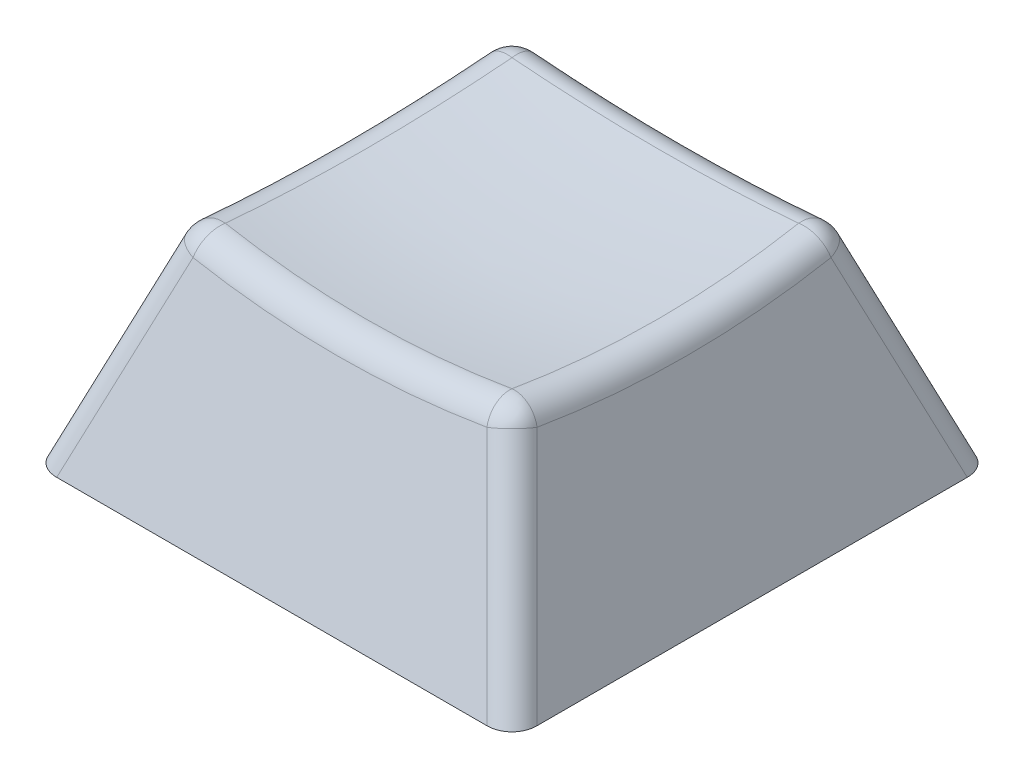
ISO-10303-21;
HEADER;
FILE_DESCRIPTION(('STEP AP214'),'2;1');
FILE_NAME('part.step','',(''),(''),'','','');
FILE_SCHEMA(('AUTOMOTIVE_DESIGN { 1 0 10303 214 1 1 1 1 }'));
ENDSEC;
DATA;
#1=APPLICATION_CONTEXT('core data for automotive mechanical design processes');
#2=APPLICATION_PROTOCOL_DEFINITION('international standard','automotive_design',2000,#1);
#3=PRODUCT_CONTEXT('',#1,'mechanical');
#4=PRODUCT('Part','Part','',(#3));
#5=PRODUCT_RELATED_PRODUCT_CATEGORY('part','',(#4));
#6=PRODUCT_DEFINITION_FORMATION('','',#4);
#7=PRODUCT_DEFINITION_CONTEXT('part definition',#1,'design');
#8=PRODUCT_DEFINITION('design','',#6,#7);
#9=PRODUCT_DEFINITION_SHAPE('','',#8);
#10=(LENGTH_UNIT() NAMED_UNIT(*) SI_UNIT(.MILLI.,.METRE.));
#11=(NAMED_UNIT(*) PLANE_ANGLE_UNIT() SI_UNIT($,.RADIAN.));
#12=(NAMED_UNIT(*) SI_UNIT($,.STERADIAN.) SOLID_ANGLE_UNIT());
#13=UNCERTAINTY_MEASURE_WITH_UNIT(LENGTH_MEASURE(1.E-05),#10,'distance_accuracy_value','');
#14=(GEOMETRIC_REPRESENTATION_CONTEXT(3) GLOBAL_UNCERTAINTY_ASSIGNED_CONTEXT((#13)) GLOBAL_UNIT_ASSIGNED_CONTEXT((#10,
#11,#12)) REPRESENTATION_CONTEXT('',''));
#15=CARTESIAN_POINT('',(0.,0.,0.));
#16=DIRECTION('',(0.,0.,1.));
#17=DIRECTION('',(1.,0.,0.));
#18=AXIS2_PLACEMENT_3D('',#15,#16,#17);
#19=CARTESIAN_POINT('',(9.,0.,9.));
#20=DIRECTION('',(0.,0.337095258423083,0.941470544812038));
#21=DIRECTION('',(0.,-0.941470544812038,0.337095258423083));
#22=AXIS2_PLACEMENT_3D('',#19,#20,#21);
#23=PLANE('',#22);
#24=DIRECTION('',(-1.,0.,0.));
#25=VECTOR('',#24,1.);
#26=CARTESIAN_POINT('',(9.,0.,9.));
#27=LINE('',#26,#25);
#28=CARTESIAN_POINT('',(8.05852945518796,0.,9.));
#29=VERTEX_POINT('',#28);
#30=CARTESIAN_POINT('',(-8.05852945518796,0.,9.));
#31=VERTEX_POINT('',#30);
#32=EDGE_CURVE('E265',#29,#31,#27,.T.);
#33=ORIENTED_EDGE('',*,*,#32,.F.);
#34=DIRECTION('',(0.31943430634042,-0.892145418564502,0.319434306340419));
#35=VECTOR('',#34,1.);
#36=CARTESIAN_POINT('',(8.15459548654862,-0.268302020343256,9.09606603136065));
#37=LINE('',#36,#35);
#38=CARTESIAN_POINT('',(5.50538439485167,7.13065761346935,6.4468549396637));
#39=VERTEX_POINT('',#38);
#40=EDGE_CURVE('E304',#29,#39,#37,.F.);
#41=ORIENTED_EDGE('',*,*,#40,.T.);
#42=CARTESIAN_POINT('',(0.,44.5576506117063,-6.95394867151931));
#43=DIRECTION('',(0.,0.337095258423083,0.941470544812038));
#44=DIRECTION('',(0.,-0.941470544812038,0.337095258423083));
#45=AXIS2_PLACEMENT_3D('',#42,#43,#44);
#46=CIRCLE('',#45,40.1331608479902);
#47=CARTESIAN_POINT('',(-5.50538439485167,7.13065761346935,6.44685493966371));
#48=VERTEX_POINT('',#47);
#49=EDGE_CURVE('E302',#39,#48,#46,.F.);
#50=ORIENTED_EDGE('',*,*,#49,.T.);
#51=DIRECTION('',(0.319434306340419,0.892145418564502,-0.31943430634042));
#52=VECTOR('',#51,1.);
#53=CARTESIAN_POINT('',(-8.15459548654862,-0.268302020343256,9.09606603136065));
#54=LINE('',#53,#52);
#55=EDGE_CURVE('E300',#48,#31,#54,.F.);
#56=ORIENTED_EDGE('',*,*,#55,.T.);
#57=EDGE_LOOP('',(#33,#41,#50,#56));
#58=FACE_BOUND('',#57,.T.);
#59=ADVANCED_FACE('F35',(#58),#23,.T.);
#60=CARTESIAN_POINT('',(9.,0.,-9.));
#61=DIRECTION('',(0.941470544812038,0.337095258423083,0.));
#62=DIRECTION('',(-0.337095258423083,0.941470544812038,0.));
#63=AXIS2_PLACEMENT_3D('',#60,#61,#62);
#64=PLANE('',#63);
#65=CARTESIAN_POINT('',(-6.95394867151931,44.5576506117063,0.));
#66=DIRECTION('',(0.941470544812038,0.337095258423083,0.));
#67=DIRECTION('',(-0.337095258423083,0.941470544812038,0.));
#68=AXIS2_PLACEMENT_3D('',#65,#66,#67);
#69=CIRCLE('',#68,40.1331608479902);
#70=CARTESIAN_POINT('',(6.4468549396637,7.13065761346936,-5.50538439485167));
#71=VERTEX_POINT('',#70);
#72=CARTESIAN_POINT('',(6.4468549396637,7.13065761346935,5.50538439485167));
#73=VERTEX_POINT('',#72);
#74=EDGE_CURVE('E296',#71,#73,#69,.F.);
#75=ORIENTED_EDGE('',*,*,#74,.T.);
#76=DIRECTION('',(0.31943430634042,-0.892145418564502,0.319434306340419));
#77=VECTOR('',#76,1.);
#78=CARTESIAN_POINT('',(7.25937706215132,4.86137133246757,6.31790651733929));
#79=LINE('',#78,#77);
#80=CARTESIAN_POINT('',(9.,0.,8.05852945518797));
#81=VERTEX_POINT('',#80);
#82=EDGE_CURVE('E298',#73,#81,#79,.T.);
#83=ORIENTED_EDGE('',*,*,#82,.T.);
#84=DIRECTION('',(0.,0.,1.));
#85=VECTOR('',#84,1.);
#86=CARTESIAN_POINT('',(9.,0.,-9.));
#87=LINE('',#86,#85);
#88=CARTESIAN_POINT('',(9.,0.,-8.05852945518796));
#89=VERTEX_POINT('',#88);
#90=EDGE_CURVE('E275',#89,#81,#87,.T.);
#91=ORIENTED_EDGE('',*,*,#90,.F.);
#92=DIRECTION('',(-0.319434306340419,0.892145418564502,0.31943430634042));
#93=VECTOR('',#92,1.);
#94=CARTESIAN_POINT('',(6.23165133220183,7.73169797965676,-5.29018078738979));
#95=LINE('',#94,#93);
#96=EDGE_CURVE('E294',#89,#71,#95,.T.);
#97=ORIENTED_EDGE('',*,*,#96,.T.);
#98=EDGE_LOOP('',(#75,#83,#91,#97));
#99=FACE_BOUND('',#98,.T.);
#100=ADVANCED_FACE('F388',(#99),#64,.T.);
#101=CARTESIAN_POINT('',(9.,0.,-9.));
#102=DIRECTION('',(0.,0.337095258423083,-0.941470544812038));
#103=DIRECTION('',(0.,0.941470544812038,0.337095258423083));
#104=AXIS2_PLACEMENT_3D('',#101,#102,#103);
#105=PLANE('',#104);
#106=DIRECTION('',(-1.,0.,0.));
#107=VECTOR('',#106,1.);
#108=CARTESIAN_POINT('',(9.,0.,-9.));
#109=LINE('',#108,#107);
#110=CARTESIAN_POINT('',(8.05852945518796,0.,-9.));
#111=VERTEX_POINT('',#110);
#112=CARTESIAN_POINT('',(-8.05852945518796,0.,-9.));
#113=VERTEX_POINT('',#112);
#114=EDGE_CURVE('E272',#111,#113,#109,.T.);
#115=ORIENTED_EDGE('',*,*,#114,.T.);
#116=DIRECTION('',(0.31943430634042,0.892145418564502,0.319434306340419));
#117=VECTOR('',#116,1.);
#118=CARTESIAN_POINT('',(-6.31790651733929,4.86137133246757,-7.25937706215132));
#119=LINE('',#118,#117);
#120=CARTESIAN_POINT('',(-5.50538439485167,7.13065761346936,-6.4468549396637));
#121=VERTEX_POINT('',#120);
#122=EDGE_CURVE('E283',#113,#121,#119,.T.);
#123=ORIENTED_EDGE('',*,*,#122,.T.);
#124=CARTESIAN_POINT('',(0.,44.5576506117063,6.95394867151931));
#125=DIRECTION('',(0.,0.337095258423083,-0.941470544812038));
#126=DIRECTION('',(0.,0.941470544812038,0.337095258423083));
#127=AXIS2_PLACEMENT_3D('',#124,#125,#126);
#128=CIRCLE('',#127,40.1331608479902);
#129=CARTESIAN_POINT('',(5.50538439485166,7.13065761346935,-6.44685493966371));
#130=VERTEX_POINT('',#129);
#131=EDGE_CURVE('E280',#121,#130,#128,.F.);
#132=ORIENTED_EDGE('',*,*,#131,.T.);
#133=DIRECTION('',(0.319434306340419,-0.892145418564502,-0.31943430634042));
#134=VECTOR('',#133,1.);
#135=CARTESIAN_POINT('',(8.15459548654861,-0.268302020343256,-9.09606603136065));
#136=LINE('',#135,#134);
#137=EDGE_CURVE('E278',#130,#111,#136,.T.);
#138=ORIENTED_EDGE('',*,*,#137,.T.);
#139=EDGE_LOOP('',(#115,#123,#132,#138));
#140=FACE_BOUND('',#139,.T.);
#141=ADVANCED_FACE('F378',(#140),#105,.T.);
#142=CARTESIAN_POINT('',(-9.,0.,-9.));
#143=DIRECTION('',(-0.941470544812038,0.337095258423083,0.));
#144=DIRECTION('',(-0.337095258423083,-0.941470544812038,0.));
#145=AXIS2_PLACEMENT_3D('',#142,#143,#144);
#146=PLANE('',#145);
#147=CARTESIAN_POINT('',(6.95394867151931,44.5576506117063,0.));
#148=DIRECTION('',(-0.941470544812038,0.337095258423083,0.));
#149=DIRECTION('',(-0.337095258423083,-0.941470544812038,0.));
#150=AXIS2_PLACEMENT_3D('',#147,#148,#149);
#151=CIRCLE('',#150,40.1331608479902);
#152=CARTESIAN_POINT('',(-6.4468549396637,7.13065761346935,5.50538439485167));
#153=VERTEX_POINT('',#152);
#154=CARTESIAN_POINT('',(-6.44685493966371,7.13065761346936,-5.50538439485167));
#155=VERTEX_POINT('',#154);
#156=EDGE_CURVE('E308',#153,#155,#151,.F.);
#157=ORIENTED_EDGE('',*,*,#156,.T.);
#158=DIRECTION('',(0.31943430634042,0.892145418564502,0.319434306340419));
#159=VECTOR('',#158,1.);
#160=CARTESIAN_POINT('',(-9.09606603136066,-0.268302020343255,-8.15459548654862));
#161=LINE('',#160,#159);
#162=CARTESIAN_POINT('',(-9.,0.,-8.05852945518796));
#163=VERTEX_POINT('',#162);
#164=EDGE_CURVE('E310',#155,#163,#161,.F.);
#165=ORIENTED_EDGE('',*,*,#164,.T.);
#166=DIRECTION('',(0.,0.,1.));
#167=VECTOR('',#166,1.);
#168=CARTESIAN_POINT('',(-9.,0.,-9.));
#169=LINE('',#168,#167);
#170=CARTESIAN_POINT('',(-9.,0.,8.05852945518796));
#171=VERTEX_POINT('',#170);
#172=EDGE_CURVE('E268',#163,#171,#169,.T.);
#173=ORIENTED_EDGE('',*,*,#172,.T.);
#174=DIRECTION('',(-0.319434306340419,-0.892145418564502,0.31943430634042));
#175=VECTOR('',#174,1.);
#176=CARTESIAN_POINT('',(-6.23165133220183,7.73169797965675,5.29018078738979));
#177=LINE('',#176,#175);
#178=EDGE_CURVE('E306',#171,#153,#177,.F.);
#179=ORIENTED_EDGE('',*,*,#178,.T.);
#180=EDGE_LOOP('',(#157,#165,#173,#179));
#181=FACE_BOUND('',#180,.T.);
#182=ADVANCED_FACE('F364',(#181),#146,.T.);
#183=CARTESIAN_POINT('',(0.,0.,0.));
#184=DIRECTION('',(0.,1.,0.));
#185=DIRECTION('',(0.,0.,1.));
#186=AXIS2_PLACEMENT_3D('',#183,#184,#185);
#187=PLANE('',#186);
#188=DIRECTION('',(1.,0.,0.));
#189=VECTOR('',#188,1.);
#190=CARTESIAN_POINT('',(9.,0.,-7.40674781779873));
#191=LINE('',#190,#189);
#192=CARTESIAN_POINT('',(7.40674781779872,0.,-7.40674781779873));
#193=VERTEX_POINT('',#192);
#194=CARTESIAN_POINT('',(-7.40674781779873,0.,-7.40674781779873));
#195=VERTEX_POINT('',#194);
#196=EDGE_CURVE('E260',#193,#195,#191,.F.);
#197=ORIENTED_EDGE('',*,*,#196,.T.);
#198=DIRECTION('',(0.,0.,-1.));
#199=VECTOR('',#198,1.);
#200=CARTESIAN_POINT('',(-7.40674781779873,0.,-9.));
#201=LINE('',#200,#199);
#202=CARTESIAN_POINT('',(-7.40674781779873,0.,7.40674781779873));
#203=VERTEX_POINT('',#202);
#204=EDGE_CURVE('E257',#195,#203,#201,.F.);
#205=ORIENTED_EDGE('',*,*,#204,.T.);
#206=DIRECTION('',(-1.,0.,0.));
#207=VECTOR('',#206,1.);
#208=CARTESIAN_POINT('',(9.,0.,7.40674781779873));
#209=LINE('',#208,#207);
#210=CARTESIAN_POINT('',(7.40674781779873,0.,7.40674781779873));
#211=VERTEX_POINT('',#210);
#212=EDGE_CURVE('E243',#211,#203,#209,.T.);
#213=ORIENTED_EDGE('',*,*,#212,.F.);
#214=DIRECTION('',(0.,0.,1.));
#215=VECTOR('',#214,1.);
#216=CARTESIAN_POINT('',(7.40674781779872,0.,-9.));
#217=LINE('',#216,#215);
#218=EDGE_CURVE('E252',#193,#211,#217,.T.);
#219=ORIENTED_EDGE('',*,*,#218,.F.);
#220=EDGE_LOOP('',(#197,#205,#213,#219));
#221=FACE_BOUND('',#220,.T.);
#222=ORIENTED_EDGE('',*,*,#172,.F.);
#223=CARTESIAN_POINT('',(-7.93783187853249,0.,-7.93783187853248));
#224=DIRECTION('',(0.,1.,0.));
#225=DIRECTION('',(-0.707106781186548,0.,-0.707106781186547));
#226=AXIS2_PLACEMENT_3D('',#223,#224,#225);
#227=ELLIPSE('',#226,1.12089349918878,1.);
#228=EDGE_CURVE('E218',#163,#113,#227,.F.);
#229=ORIENTED_EDGE('',*,*,#228,.T.);
#230=ORIENTED_EDGE('',*,*,#114,.F.);
#231=CARTESIAN_POINT('',(7.93783187853248,0.,-7.93783187853249));
#232=DIRECTION('',(0.,1.,0.));
#233=DIRECTION('',(0.707106781186547,0.,-0.707106781186548));
#234=AXIS2_PLACEMENT_3D('',#231,#232,#233);
#235=ELLIPSE('',#234,1.12089349918878,1.);
#236=EDGE_CURVE('E314',#111,#89,#235,.F.);
#237=ORIENTED_EDGE('',*,*,#236,.T.);
#238=ORIENTED_EDGE('',*,*,#90,.T.);
#239=CARTESIAN_POINT('',(7.93783187853248,0.,7.93783187853249));
#240=DIRECTION('',(0.,1.,0.));
#241=DIRECTION('',(0.707106781186548,0.,0.707106781186547));
#242=AXIS2_PLACEMENT_3D('',#239,#240,#241);
#243=ELLIPSE('',#242,1.12089349918878,1.);
#244=EDGE_CURVE('E316',#81,#29,#243,.F.);
#245=ORIENTED_EDGE('',*,*,#244,.T.);
#246=ORIENTED_EDGE('',*,*,#32,.T.);
#247=CARTESIAN_POINT('',(-7.93783187853249,0.,7.93783187853249));
#248=DIRECTION('',(0.,1.,0.));
#249=DIRECTION('',(-0.707106781186547,0.,0.707106781186548));
#250=AXIS2_PLACEMENT_3D('',#247,#248,#249);
#251=ELLIPSE('',#250,1.12089349918878,1.);
#252=EDGE_CURVE('E312',#31,#171,#251,.F.);
#253=ORIENTED_EDGE('',*,*,#252,.T.);
#254=EDGE_LOOP('',(#222,#229,#230,#237,#238,#245,#246,#253));
#255=FACE_BOUND('',#254,.T.);
#256=ADVANCED_FACE('F375',(#221,#255),#187,.F.);
#257=CARTESIAN_POINT('',(0.,47.0475247106933,0.));
#258=DIRECTION('',(0.707106781186548,0.,0.707106781186548));
#259=DIRECTION('',(0.,1.,0.));
#260=AXIS2_PLACEMENT_3D('',#257,#258,#259);
#261=SPHERICAL_SURFACE('',#260,40.);
#262=CARTESIAN_POINT('',(-7.70284801593303,44.2895058254152,0.));
#263=DIRECTION('',(0.941470544812038,0.337095258423083,0.));
#264=DIRECTION('',(-0.337095258423083,0.941470544812038,0.));
#265=AXIS2_PLACEMENT_3D('',#262,#263,#264);
#266=CIRCLE('',#265,39.1543032663319);
#267=CARTESIAN_POINT('',(5.37110672668455,7.7753663149401,5.37110672668455));
#268=VERTEX_POINT('',#267);
#269=CARTESIAN_POINT('',(5.37110672668455,7.7753663149401,-5.37110672668455));
#270=VERTEX_POINT('',#269);
#271=EDGE_CURVE('E289',#268,#270,#266,.T.);
#272=ORIENTED_EDGE('',*,*,#271,.T.);
#273=CARTESIAN_POINT('',(0.,44.2895058254152,7.70284801593303));
#274=DIRECTION('',(0.,0.337095258423083,-0.941470544812038));
#275=DIRECTION('',(0.,0.941470544812038,0.337095258423083));
#276=AXIS2_PLACEMENT_3D('',#273,#274,#275);
#277=CIRCLE('',#276,39.1543032663319);
#278=CARTESIAN_POINT('',(-5.37110672668455,7.7753663149401,-5.37110672668455));
#279=VERTEX_POINT('',#278);
#280=EDGE_CURVE('E291',#270,#279,#277,.T.);
#281=ORIENTED_EDGE('',*,*,#280,.T.);
#282=CARTESIAN_POINT('',(7.70284801593303,44.2895058254152,0.));
#283=DIRECTION('',(-0.941470544812038,0.337095258423083,0.));
#284=DIRECTION('',(-0.337095258423083,-0.941470544812038,0.));
#285=AXIS2_PLACEMENT_3D('',#282,#283,#284);
#286=CIRCLE('',#285,39.1543032663319);
#287=CARTESIAN_POINT('',(-5.37110672668455,7.7753663149401,5.37110672668455));
#288=VERTEX_POINT('',#287);
#289=EDGE_CURVE('E285',#279,#288,#286,.T.);
#290=ORIENTED_EDGE('',*,*,#289,.T.);
#291=CARTESIAN_POINT('',(0.,44.2895058254152,-7.70284801593303));
#292=DIRECTION('',(0.,0.337095258423083,0.941470544812038));
#293=DIRECTION('',(0.,-0.941470544812038,0.337095258423083));
#294=AXIS2_PLACEMENT_3D('',#291,#292,#293);
#295=CIRCLE('',#294,39.1543032663319);
#296=EDGE_CURVE('E287',#288,#268,#295,.T.);
#297=ORIENTED_EDGE('',*,*,#296,.T.);
#298=EDGE_LOOP('',(#272,#281,#290,#297));
#299=FACE_BOUND('',#298,.T.);
#300=ADVANCED_FACE('F405',(#299),#261,.F.);
#301=CARTESIAN_POINT('',(-6.31790651733929,4.52427607404449,6.31790651733929));
#302=DIRECTION('',(-0.319434306340419,-0.892145418564502,0.31943430634042));
#303=DIRECTION('',(0.,-0.337095258423083,-0.941470544812038));
#304=AXIS2_PLACEMENT_3D('',#301,#302,#303);
#305=CYLINDRICAL_SURFACE('',#304,1.);
#306=ORIENTED_EDGE('',*,*,#252,.F.);
#307=ORIENTED_EDGE('',*,*,#55,.F.);
#308=CARTESIAN_POINT('',(-5.50538439485167,6.79356235504627,5.50538439485167));
#309=DIRECTION('',(0.31943430634042,0.892145418564502,-0.319434306340419));
#310=DIRECTION('',(-0.941470544812038,0.337095258423083,0.));
#311=AXIS2_PLACEMENT_3D('',#308,#309,#310);
#312=CIRCLE('',#311,1.);
#313=EDGE_CURVE('E346',#153,#48,#312,.T.);
#314=ORIENTED_EDGE('',*,*,#313,.F.);
#315=ORIENTED_EDGE('',*,*,#178,.F.);
#316=EDGE_LOOP('',(#306,#307,#314,#315));
#317=FACE_BOUND('',#316,.T.);
#318=ADVANCED_FACE('F37',(#317),#305,.T.);
#319=CARTESIAN_POINT('',(6.31790651733929,4.52427607404449,6.31790651733929));
#320=DIRECTION('',(0.31943430634042,-0.892145418564502,0.319434306340419));
#321=DIRECTION('',(0.941470544812038,0.337095258423083,0.));
#322=AXIS2_PLACEMENT_3D('',#319,#320,#321);
#323=CYLINDRICAL_SURFACE('',#322,1.);
#324=ORIENTED_EDGE('',*,*,#244,.F.);
#325=ORIENTED_EDGE('',*,*,#82,.F.);
#326=CARTESIAN_POINT('',(5.50538439485167,6.79356235504627,5.50538439485167));
#327=DIRECTION('',(-0.31943430634042,0.892145418564501,-0.31943430634042));
#328=DIRECTION('',(-0.941470544812037,-0.337095258423083,0.));
#329=AXIS2_PLACEMENT_3D('',#326,#327,#328);
#330=CIRCLE('',#329,1.);
#331=EDGE_CURVE('E343',#39,#73,#330,.T.);
#332=ORIENTED_EDGE('',*,*,#331,.F.);
#333=ORIENTED_EDGE('',*,*,#40,.F.);
#334=EDGE_LOOP('',(#324,#325,#332,#333));
#335=FACE_BOUND('',#334,.T.);
#336=ADVANCED_FACE('F393',(#335),#323,.T.);
#337=CARTESIAN_POINT('',(0.,44.2205553532832,-7.89541921633135));
#338=DIRECTION('',(0.,0.337095258423083,0.941470544812038));
#339=DIRECTION('',(0.,-0.941470544812038,0.337095258423083));
#340=AXIS2_PLACEMENT_3D('',#337,#338,#339);
#341=TOROIDAL_SURFACE('',#340,40.1331608479902,1.);
#342=CARTESIAN_POINT('',(-5.50538439485167,6.79356235504627,5.50538439485167));
#343=DIRECTION('',(-0.990546421092721,0.129148991410189,-0.0462420336721102));
#344=DIRECTION('',(-0.129287294554948,-0.991607178002793,0.));
#345=AXIS2_PLACEMENT_3D('',#342,#343,#344);
#346=CIRCLE('',#345,1.);
#347=EDGE_CURVE('E269',#48,#288,#346,.T.);
#348=ORIENTED_EDGE('',*,*,#347,.F.);
#349=ORIENTED_EDGE('',*,*,#49,.F.);
#350=CARTESIAN_POINT('',(5.50538439485166,6.79356235504627,5.50538439485166));
#351=DIRECTION('',(0.990546421092722,0.129148991410186,-0.0462420336721104));
#352=DIRECTION('',(-0.129287294554945,0.991607178002793,0.));
#353=AXIS2_PLACEMENT_3D('',#350,#351,#352);
#354=CIRCLE('',#353,1.);
#355=EDGE_CURVE('E340',#268,#39,#354,.T.);
#356=ORIENTED_EDGE('',*,*,#355,.F.);
#357=ORIENTED_EDGE('',*,*,#296,.F.);
#358=EDGE_LOOP('',(#348,#349,#356,#357));
#359=FACE_BOUND('',#358,.T.);
#360=ADVANCED_FACE('F406',(#359),#341,.T.);
#361=CARTESIAN_POINT('',(-5.50538439485167,6.79356235504627,5.50538439485167));
#362=DIRECTION('',(0.,0.,1.));
#363=DIRECTION('',(1.,0.,0.));
#364=AXIS2_PLACEMENT_3D('',#361,#362,#363);
#365=SPHERICAL_SURFACE('',#364,1.);
#366=ORIENTED_EDGE('',*,*,#313,.T.);
#367=ORIENTED_EDGE('',*,*,#347,.T.);
#368=CARTESIAN_POINT('',(-5.50538439485167,6.79356235504627,5.50538439485167));
#369=DIRECTION('',(0.0462420336721088,0.129148991410186,0.990546421092722));
#370=DIRECTION('',(0.,-0.991607178002793,0.129287294554945));
#371=AXIS2_PLACEMENT_3D('',#368,#369,#370);
#372=CIRCLE('',#371,1.);
#373=EDGE_CURVE('E337',#153,#288,#372,.F.);
#374=ORIENTED_EDGE('',*,*,#373,.F.);
#375=EDGE_LOOP('',(#366,#367,#374));
#376=FACE_BOUND('',#375,.T.);
#377=ADVANCED_FACE('F352',(#376),#365,.T.);
#378=CARTESIAN_POINT('',(5.50538439485167,6.79356235504627,5.50538439485167));
#379=DIRECTION('',(0.,0.,1.));
#380=DIRECTION('',(1.,0.,0.));
#381=AXIS2_PLACEMENT_3D('',#378,#379,#380);
#382=SPHERICAL_SURFACE('',#381,1.);
#383=ORIENTED_EDGE('',*,*,#355,.T.);
#384=ORIENTED_EDGE('',*,*,#331,.T.);
#385=CARTESIAN_POINT('',(5.50538439485167,6.79356235504627,5.50538439485167));
#386=DIRECTION('',(-0.0462420336721108,0.129148991410191,0.990546421092721));
#387=DIRECTION('',(0.,-0.991607178002792,0.12928729455495));
#388=AXIS2_PLACEMENT_3D('',#385,#386,#387);
#389=CIRCLE('',#388,1.);
#390=EDGE_CURVE('E334',#268,#73,#389,.F.);
#391=ORIENTED_EDGE('',*,*,#390,.F.);
#392=EDGE_LOOP('',(#383,#384,#391));
#393=FACE_BOUND('',#392,.T.);
#394=ADVANCED_FACE('F397',(#393),#382,.T.);
#395=CARTESIAN_POINT('',(7.89541921633135,44.2205553532832,0.));
#396=DIRECTION('',(-0.941470544812038,0.337095258423083,0.));
#397=DIRECTION('',(-0.337095258423083,-0.941470544812038,0.));
#398=AXIS2_PLACEMENT_3D('',#395,#396,#397);
#399=TOROIDAL_SURFACE('',#398,40.1331608479902,1.);
#400=ORIENTED_EDGE('',*,*,#373,.T.);
#401=ORIENTED_EDGE('',*,*,#289,.F.);
#402=CARTESIAN_POINT('',(-5.50538439485167,6.79356235504627,-5.50538439485167));
#403=DIRECTION('',(0.0462420336721108,0.129148991410191,-0.990546421092721));
#404=DIRECTION('',(0.,0.991607178002793,0.12928729455495));
#405=AXIS2_PLACEMENT_3D('',#402,#403,#404);
#406=CIRCLE('',#405,1.);
#407=EDGE_CURVE('E331',#155,#279,#406,.T.);
#408=ORIENTED_EDGE('',*,*,#407,.F.);
#409=ORIENTED_EDGE('',*,*,#156,.F.);
#410=EDGE_LOOP('',(#400,#401,#408,#409));
#411=FACE_BOUND('',#410,.T.);
#412=ADVANCED_FACE('F360',(#411),#399,.T.);
#413=CARTESIAN_POINT('',(-8.15459548654862,-0.605397278766338,-8.15459548654862));
#414=DIRECTION('',(-0.31943430634042,-0.892145418564502,-0.319434306340419));
#415=DIRECTION('',(0.941470544812038,-0.337095258423083,0.));
#416=AXIS2_PLACEMENT_3D('',#413,#414,#415);
#417=CYLINDRICAL_SURFACE('',#416,1.);
#418=ORIENTED_EDGE('',*,*,#228,.F.);
#419=ORIENTED_EDGE('',*,*,#164,.F.);
#420=CARTESIAN_POINT('',(-5.50538439485167,6.79356235504627,-5.50538439485166));
#421=DIRECTION('',(0.31943430634042,0.892145418564502,0.31943430634042));
#422=DIRECTION('',(0.,-0.337095258423083,0.941470544812038));
#423=AXIS2_PLACEMENT_3D('',#420,#421,#422);
#424=CIRCLE('',#423,1.);
#425=EDGE_CURVE('E328',#121,#155,#424,.T.);
#426=ORIENTED_EDGE('',*,*,#425,.F.);
#427=ORIENTED_EDGE('',*,*,#122,.F.);
#428=EDGE_LOOP('',(#418,#419,#426,#427));
#429=FACE_BOUND('',#428,.T.);
#430=ADVANCED_FACE('F370',(#429),#417,.T.);
#431=CARTESIAN_POINT('',(8.15459548654861,-0.605397278766338,-8.15459548654862));
#432=DIRECTION('',(0.319434306340419,-0.892145418564502,-0.31943430634042));
#433=DIRECTION('',(0.,0.337095258423083,-0.941470544812038));
#434=AXIS2_PLACEMENT_3D('',#431,#432,#433);
#435=CYLINDRICAL_SURFACE('',#434,1.);
#436=ORIENTED_EDGE('',*,*,#236,.F.);
#437=ORIENTED_EDGE('',*,*,#137,.F.);
#438=CARTESIAN_POINT('',(5.50538439485166,6.79356235504628,-5.50538439485167));
#439=DIRECTION('',(-0.31943430634042,0.892145418564503,0.319434306340415));
#440=DIRECTION('',(-0.941470544812038,-0.337095258423083,0.));
#441=AXIS2_PLACEMENT_3D('',#438,#439,#440);
#442=CIRCLE('',#441,1.);
#443=EDGE_CURVE('E325',#71,#130,#442,.T.);
#444=ORIENTED_EDGE('',*,*,#443,.F.);
#445=ORIENTED_EDGE('',*,*,#96,.F.);
#446=EDGE_LOOP('',(#436,#437,#444,#445));
#447=FACE_BOUND('',#446,.T.);
#448=ADVANCED_FACE('F383',(#447),#435,.T.);
#449=CARTESIAN_POINT('',(-7.89541921633135,44.2205553532832,0.));
#450=DIRECTION('',(0.941470544812038,0.337095258423083,0.));
#451=DIRECTION('',(-0.337095258423083,0.941470544812038,0.));
#452=AXIS2_PLACEMENT_3D('',#449,#450,#451);
#453=TOROIDAL_SURFACE('',#452,40.1331608479902,1.);
#454=ORIENTED_EDGE('',*,*,#390,.T.);
#455=ORIENTED_EDGE('',*,*,#74,.F.);
#456=CARTESIAN_POINT('',(5.50538439485166,6.79356235504627,-5.50538439485167));
#457=DIRECTION('',(-0.0462420336721087,0.129148991410186,-0.990546421092722));
#458=DIRECTION('',(0.,0.991607178002793,0.129287294554945));
#459=AXIS2_PLACEMENT_3D('',#456,#457,#458);
#460=CIRCLE('',#459,1.);
#461=EDGE_CURVE('E322',#270,#71,#460,.T.);
#462=ORIENTED_EDGE('',*,*,#461,.F.);
#463=ORIENTED_EDGE('',*,*,#271,.F.);
#464=EDGE_LOOP('',(#454,#455,#462,#463));
#465=FACE_BOUND('',#464,.T.);
#466=ADVANCED_FACE('F401',(#465),#453,.T.);
#467=CARTESIAN_POINT('',(-5.50538439485167,6.79356235504627,-5.50538439485166));
#468=DIRECTION('',(0.,0.,1.));
#469=DIRECTION('',(1.,0.,0.));
#470=AXIS2_PLACEMENT_3D('',#467,#468,#469);
#471=SPHERICAL_SURFACE('',#470,1.);
#472=ORIENTED_EDGE('',*,*,#425,.T.);
#473=ORIENTED_EDGE('',*,*,#407,.T.);
#474=CARTESIAN_POINT('',(-5.50538439485167,6.79356235504627,-5.50538439485166));
#475=DIRECTION('',(-0.990546421092722,0.129148991410186,0.0462420336721113));
#476=DIRECTION('',(-0.129287294554945,-0.991607178002793,0.));
#477=AXIS2_PLACEMENT_3D('',#474,#475,#476);
#478=CIRCLE('',#477,1.);
#479=EDGE_CURVE('E320',#121,#279,#478,.F.);
#480=ORIENTED_EDGE('',*,*,#479,.F.);
#481=EDGE_LOOP('',(#472,#473,#480));
#482=FACE_BOUND('',#481,.T.);
#483=ADVANCED_FACE('F438',(#482),#471,.T.);
#484=CARTESIAN_POINT('',(5.50538439485166,6.79356235504627,-5.50538439485167));
#485=DIRECTION('',(0.,0.,1.));
#486=DIRECTION('',(1.,0.,0.));
#487=AXIS2_PLACEMENT_3D('',#484,#485,#486);
#488=SPHERICAL_SURFACE('',#487,1.);
#489=ORIENTED_EDGE('',*,*,#461,.T.);
#490=ORIENTED_EDGE('',*,*,#443,.T.);
#491=CARTESIAN_POINT('',(5.50538439485166,6.79356235504627,-5.50538439485167));
#492=DIRECTION('',(0.990546421092721,0.129148991410189,0.0462420336721102));
#493=DIRECTION('',(-0.129287294554948,0.991607178002793,0.));
#494=AXIS2_PLACEMENT_3D('',#491,#492,#493);
#495=CIRCLE('',#494,1.);
#496=EDGE_CURVE('E254',#270,#130,#495,.F.);
#497=ORIENTED_EDGE('',*,*,#496,.F.);
#498=EDGE_LOOP('',(#489,#490,#497));
#499=FACE_BOUND('',#498,.T.);
#500=ADVANCED_FACE('F434',(#499),#488,.T.);
#501=CARTESIAN_POINT('',(0.,44.2205553532832,7.89541921633135));
#502=DIRECTION('',(0.,0.337095258423083,-0.941470544812038));
#503=DIRECTION('',(0.,0.941470544812038,0.337095258423083));
#504=AXIS2_PLACEMENT_3D('',#501,#502,#503);
#505=TOROIDAL_SURFACE('',#504,40.1331608479902,1.);
#506=ORIENTED_EDGE('',*,*,#479,.T.);
#507=ORIENTED_EDGE('',*,*,#280,.F.);
#508=ORIENTED_EDGE('',*,*,#496,.T.);
#509=ORIENTED_EDGE('',*,*,#131,.F.);
#510=EDGE_LOOP('',(#506,#507,#508,#509));
#511=FACE_BOUND('',#510,.T.);
#512=ADVANCED_FACE('F430',(#511),#505,.T.);
#513=CARTESIAN_POINT('',(9.,-0.505642887634624,7.58779418278194));
#514=DIRECTION('',(0.,0.337095258423083,0.941470544812038));
#515=DIRECTION('',(0.,-0.941470544812038,0.337095258423083));
#516=AXIS2_PLACEMENT_3D('',#513,#514,#515);
#517=PLANE('',#516);
#518=DIRECTION('',(0.319434306340419,0.892145418564502,-0.31943430634042));
#519=VECTOR('',#518,1.);
#520=CARTESIAN_POINT('',(-5.89520426061359,4.22157743466132,5.89520426061359));
#521=LINE('',#520,#519);
#522=CARTESIAN_POINT('',(-5.70152594220574,4.7625,5.70152594220574));
#523=VERTEX_POINT('',#522);
#524=EDGE_CURVE('E247',#523,#203,#521,.F.);
#525=ORIENTED_EDGE('',*,*,#524,.F.);
#526=DIRECTION('',(1.,0.,0.));
#527=VECTOR('',#526,1.);
#528=CARTESIAN_POINT('',(9.,4.7625,5.70152594220574));
#529=LINE('',#528,#527);
#530=CARTESIAN_POINT('',(5.70152594220574,4.7625,5.70152594220574));
#531=VERTEX_POINT('',#530);
#532=EDGE_CURVE('E51',#523,#531,#529,.T.);
#533=ORIENTED_EDGE('',*,*,#532,.T.);
#534=DIRECTION('',(0.31943430634042,-0.892145418564502,0.319434306340419));
#535=VECTOR('',#534,1.);
#536=CARTESIAN_POINT('',(5.89520426061359,4.22157743466132,5.89520426061359));
#537=LINE('',#536,#535);
#538=EDGE_CURVE('E245',#531,#211,#537,.T.);
#539=ORIENTED_EDGE('',*,*,#538,.T.);
#540=ORIENTED_EDGE('',*,*,#212,.T.);
#541=EDGE_LOOP('',(#525,#533,#539,#540));
#542=FACE_BOUND('',#541,.T.);
#543=ADVANCED_FACE('F433',(#542),#517,.F.);
#544=CARTESIAN_POINT('',(7.58779418278194,-0.505642887634624,-9.));
#545=DIRECTION('',(0.941470544812038,0.337095258423083,0.));
#546=DIRECTION('',(-0.337095258423083,0.941470544812038,0.));
#547=AXIS2_PLACEMENT_3D('',#544,#545,#546);
#548=PLANE('',#547);
#549=ORIENTED_EDGE('',*,*,#538,.F.);
#550=DIRECTION('',(0.,0.,-1.));
#551=VECTOR('',#550,1.);
#552=CARTESIAN_POINT('',(5.70152594220574,4.7625,-9.));
#553=LINE('',#552,#551);
#554=CARTESIAN_POINT('',(5.70152594220574,4.7625,-5.70152594220574));
#555=VERTEX_POINT('',#554);
#556=EDGE_CURVE('E58',#531,#555,#553,.T.);
#557=ORIENTED_EDGE('',*,*,#556,.T.);
#558=DIRECTION('',(-0.319434306340419,0.892145418564502,0.31943430634042));
#559=VECTOR('',#558,1.);
#560=CARTESIAN_POINT('',(7.73189322982292,-0.908095918149508,-7.73189322982292));
#561=LINE('',#560,#559);
#562=EDGE_CURVE('E248',#555,#193,#561,.F.);
#563=ORIENTED_EDGE('',*,*,#562,.T.);
#564=ORIENTED_EDGE('',*,*,#218,.T.);
#565=EDGE_LOOP('',(#549,#557,#563,#564));
#566=FACE_BOUND('',#565,.T.);
#567=ADVANCED_FACE('F503',(#566),#548,.F.);
#568=CARTESIAN_POINT('',(9.,-0.505642887634624,-7.58779418278194));
#569=DIRECTION('',(0.,0.337095258423083,-0.941470544812038));
#570=DIRECTION('',(0.,0.941470544812038,0.337095258423083));
#571=AXIS2_PLACEMENT_3D('',#568,#569,#570);
#572=PLANE('',#571);
#573=DIRECTION('',(-1.,0.,0.));
#574=VECTOR('',#573,1.);
#575=CARTESIAN_POINT('',(9.,4.7625,-5.70152594220574));
#576=LINE('',#575,#574);
#577=CARTESIAN_POINT('',(-5.70152594220574,4.7625,-5.70152594220574));
#578=VERTEX_POINT('',#577);
#579=EDGE_CURVE('E770',#578,#555,#576,.F.);
#580=ORIENTED_EDGE('',*,*,#579,.F.);
#581=DIRECTION('',(-0.31943430634042,-0.892145418564502,-0.319434306340419));
#582=VECTOR('',#581,1.);
#583=CARTESIAN_POINT('',(-7.73189322982293,-0.908095918149508,-7.73189322982292));
#584=LINE('',#583,#582);
#585=EDGE_CURVE('E250',#578,#195,#584,.T.);
#586=ORIENTED_EDGE('',*,*,#585,.T.);
#587=ORIENTED_EDGE('',*,*,#196,.F.);
#588=ORIENTED_EDGE('',*,*,#562,.F.);
#589=EDGE_LOOP('',(#580,#586,#587,#588));
#590=FACE_BOUND('',#589,.T.);
#591=ADVANCED_FACE('F511',(#590),#572,.F.);
#592=CARTESIAN_POINT('',(-7.58779418278195,-0.505642887634624,-9.));
#593=DIRECTION('',(-0.941470544812038,0.337095258423083,0.));
#594=DIRECTION('',(-0.337095258423083,-0.941470544812038,0.));
#595=AXIS2_PLACEMENT_3D('',#592,#593,#594);
#596=PLANE('',#595);
#597=DIRECTION('',(0.,0.,1.));
#598=VECTOR('',#597,1.);
#599=CARTESIAN_POINT('',(-5.70152594220575,4.7625,-9.));
#600=LINE('',#599,#598);
#601=EDGE_CURVE('E772',#523,#578,#600,.F.);
#602=ORIENTED_EDGE('',*,*,#601,.F.);
#603=ORIENTED_EDGE('',*,*,#524,.T.);
#604=ORIENTED_EDGE('',*,*,#204,.F.);
#605=ORIENTED_EDGE('',*,*,#585,.F.);
#606=EDGE_LOOP('',(#602,#603,#604,#605));
#607=FACE_BOUND('',#606,.T.);
#608=ADVANCED_FACE('F518',(#607),#596,.F.);
#609=CARTESIAN_POINT('',(0.,4.7625,0.));
#610=DIRECTION('',(0.,-1.,0.));
#611=DIRECTION('',(0.,0.,-1.));
#612=AXIS2_PLACEMENT_3D('',#609,#610,#611);
#613=PLANE('',#612);
#614=CARTESIAN_POINT('',(0.,4.7625,0.));
#615=DIRECTION('',(0.,-1.,0.));
#616=DIRECTION('',(0.,0.,-1.));
#617=AXIS2_PLACEMENT_3D('',#614,#615,#616);
#618=CIRCLE('',#617,2.75);
#619=CARTESIAN_POINT('',(0.,4.7625,-2.75));
#620=VERTEX_POINT('',#619);
#621=EDGE_CURVE('E11',#620,#620,#618,.F.);
#622=ORIENTED_EDGE('',*,*,#621,.T.);
#623=EDGE_LOOP('',(#622));
#624=FACE_BOUND('',#623,.T.);
#625=ORIENTED_EDGE('',*,*,#532,.F.);
#626=ORIENTED_EDGE('',*,*,#601,.T.);
#627=ORIENTED_EDGE('',*,*,#579,.T.);
#628=ORIENTED_EDGE('',*,*,#556,.F.);
#629=EDGE_LOOP('',(#625,#626,#627,#628));
#630=FACE_BOUND('',#629,.T.);
#631=ADVANCED_FACE('F526',(#624,#630),#613,.T.);
#632=CARTESIAN_POINT('',(0.,7.79556235504627,0.));
#633=DIRECTION('',(0.,-1.,0.));
#634=DIRECTION('',(0.,0.,-1.));
#635=AXIS2_PLACEMENT_3D('',#632,#633,#634);
#636=CYLINDRICAL_SURFACE('',#635,2.75);
#637=ORIENTED_EDGE('',*,*,#621,.F.);
#638=EDGE_LOOP('',(#637));
#639=FACE_BOUND('',#638,.T.);
#640=CARTESIAN_POINT('',(0.,0.,0.));
#641=DIRECTION('',(0.,-1.,0.));
#642=DIRECTION('',(0.,0.,-1.));
#643=AXIS2_PLACEMENT_3D('',#640,#641,#642);
#644=CIRCLE('',#643,2.75);
#645=CARTESIAN_POINT('',(0.,0.,-2.75));
#646=VERTEX_POINT('',#645);
#647=EDGE_CURVE('E240',#646,#646,#644,.T.);
#648=ORIENTED_EDGE('',*,*,#647,.F.);
#649=EDGE_LOOP('',(#648));
#650=FACE_BOUND('',#649,.T.);
#651=ADVANCED_FACE('F534',(#639,#650),#636,.T.);
#652=CARTESIAN_POINT('',(0.,0.,0.));
#653=DIRECTION('',(0.,-1.,0.));
#654=DIRECTION('',(0.,0.,-1.));
#655=AXIS2_PLACEMENT_3D('',#652,#653,#654);
#656=PLANE('',#655);
#657=DIRECTION('',(1.,0.,0.));
#658=VECTOR('',#657,1.);
#659=CARTESIAN_POINT('',(-0.55,0.,-0.55));
#660=LINE('',#659,#658);
#661=CARTESIAN_POINT('',(-2.05,0.,-0.55));
#662=VERTEX_POINT('',#661);
#663=CARTESIAN_POINT('',(-0.55,0.,-0.55));
#664=VERTEX_POINT('',#663);
#665=EDGE_CURVE('E775',#662,#664,#660,.T.);
#666=ORIENTED_EDGE('',*,*,#665,.F.);
#667=DIRECTION('',(0.,0.,-1.));
#668=VECTOR('',#667,1.);
#669=CARTESIAN_POINT('',(-2.05,0.,-0.55));
#670=LINE('',#669,#668);
#671=CARTESIAN_POINT('',(-2.05,0.,0.55));
#672=VERTEX_POINT('',#671);
#673=EDGE_CURVE('E236',#672,#662,#670,.T.);
#674=ORIENTED_EDGE('',*,*,#673,.F.);
#675=DIRECTION('',(-1.,0.,0.));
#676=VECTOR('',#675,1.);
#677=CARTESIAN_POINT('',(-2.05,0.,0.55));
#678=LINE('',#677,#676);
#679=CARTESIAN_POINT('',(-0.55,0.,0.55));
#680=VERTEX_POINT('',#679);
#681=EDGE_CURVE('E806',#680,#672,#678,.T.);
#682=ORIENTED_EDGE('',*,*,#681,.F.);
#683=DIRECTION('',(0.,0.,-1.));
#684=VECTOR('',#683,1.);
#685=CARTESIAN_POINT('',(-0.55,0.,0.55));
#686=LINE('',#685,#684);
#687=CARTESIAN_POINT('',(-0.55,0.,2.05));
#688=VERTEX_POINT('',#687);
#689=EDGE_CURVE('E803',#688,#680,#686,.T.);
#690=ORIENTED_EDGE('',*,*,#689,.F.);
#691=DIRECTION('',(-1.,0.,0.));
#692=VECTOR('',#691,1.);
#693=CARTESIAN_POINT('',(-0.55,0.,2.05));
#694=LINE('',#693,#692);
#695=CARTESIAN_POINT('',(0.55,0.,2.05));
#696=VERTEX_POINT('',#695);
#697=EDGE_CURVE('E800',#696,#688,#694,.T.);
#698=ORIENTED_EDGE('',*,*,#697,.F.);
#699=DIRECTION('',(0.,0.,1.));
#700=VECTOR('',#699,1.);
#701=CARTESIAN_POINT('',(0.55,0.,0.55));
#702=LINE('',#701,#700);
#703=CARTESIAN_POINT('',(0.55,0.,0.55));
#704=VERTEX_POINT('',#703);
#705=EDGE_CURVE('E797',#704,#696,#702,.T.);
#706=ORIENTED_EDGE('',*,*,#705,.F.);
#707=DIRECTION('',(-1.,0.,0.));
#708=VECTOR('',#707,1.);
#709=CARTESIAN_POINT('',(2.05,0.,0.55));
#710=LINE('',#709,#708);
#711=CARTESIAN_POINT('',(2.05,0.,0.55));
#712=VERTEX_POINT('',#711);
#713=EDGE_CURVE('E794',#712,#704,#710,.T.);
#714=ORIENTED_EDGE('',*,*,#713,.F.);
#715=DIRECTION('',(0.,0.,1.));
#716=VECTOR('',#715,1.);
#717=CARTESIAN_POINT('',(2.05,0.,0.));
#718=LINE('',#717,#716);
#719=CARTESIAN_POINT('',(2.05,0.,-0.55));
#720=VERTEX_POINT('',#719);
#721=EDGE_CURVE('E791',#720,#712,#718,.T.);
#722=ORIENTED_EDGE('',*,*,#721,.F.);
#723=DIRECTION('',(1.,0.,0.));
#724=VECTOR('',#723,1.);
#725=CARTESIAN_POINT('',(0.55,0.,-0.55));
#726=LINE('',#725,#724);
#727=CARTESIAN_POINT('',(0.55,0.,-0.55));
#728=VERTEX_POINT('',#727);
#729=EDGE_CURVE('E788',#728,#720,#726,.T.);
#730=ORIENTED_EDGE('',*,*,#729,.F.);
#731=DIRECTION('',(0.,0.,1.));
#732=VECTOR('',#731,1.);
#733=CARTESIAN_POINT('',(0.55,0.,-2.05));
#734=LINE('',#733,#732);
#735=CARTESIAN_POINT('',(0.55,0.,-2.05));
#736=VERTEX_POINT('',#735);
#737=EDGE_CURVE('E785',#736,#728,#734,.T.);
#738=ORIENTED_EDGE('',*,*,#737,.F.);
#739=DIRECTION('',(1.,0.,0.));
#740=VECTOR('',#739,1.);
#741=CARTESIAN_POINT('',(0.,0.,-2.05));
#742=LINE('',#741,#740);
#743=CARTESIAN_POINT('',(-0.55,0.,-2.05));
#744=VERTEX_POINT('',#743);
#745=EDGE_CURVE('E783',#744,#736,#742,.T.);
#746=ORIENTED_EDGE('',*,*,#745,.F.);
#747=DIRECTION('',(0.,0.,-1.));
#748=VECTOR('',#747,1.);
#749=CARTESIAN_POINT('',(-0.55,0.,-2.05));
#750=LINE('',#749,#748);
#751=EDGE_CURVE('E230',#664,#744,#750,.T.);
#752=ORIENTED_EDGE('',*,*,#751,.F.);
#753=EDGE_LOOP('',(#666,#674,#682,#690,#698,#706,#714,#722,#730,#738,#746,#752));
#754=FACE_BOUND('',#753,.T.);
#755=ORIENTED_EDGE('',*,*,#647,.T.);
#756=EDGE_LOOP('',(#755));
#757=FACE_BOUND('',#756,.T.);
#758=ADVANCED_FACE('F542',(#754,#757),#656,.T.);
#759=CARTESIAN_POINT('',(-0.55,7.79456235504627,-2.05));
#760=DIRECTION('',(-1.,0.,0.));
#761=DIRECTION('',(0.,0.,1.));
#762=AXIS2_PLACEMENT_3D('',#759,#760,#761);
#763=PLANE('',#762);
#764=DIRECTION('',(0.,-1.,0.));
#765=VECTOR('',#764,1.);
#766=CARTESIAN_POINT('',(-0.55,7.79456235504627,-2.05));
#767=LINE('',#766,#765);
#768=CARTESIAN_POINT('',(-0.55,4.7625,-2.05));
#769=VERTEX_POINT('',#768);
#770=EDGE_CURVE('E223',#769,#744,#767,.T.);
#771=ORIENTED_EDGE('',*,*,#770,.F.);
#772=DIRECTION('',(0.,0.,1.));
#773=VECTOR('',#772,1.);
#774=CARTESIAN_POINT('',(-0.55,4.7625,-2.05));
#775=LINE('',#774,#773);
#776=CARTESIAN_POINT('',(-0.55,4.7625,-0.55));
#777=VERTEX_POINT('',#776);
#778=EDGE_CURVE('E39',#769,#777,#775,.T.);
#779=ORIENTED_EDGE('',*,*,#778,.T.);
#780=DIRECTION('',(0.,-1.,0.));
#781=VECTOR('',#780,1.);
#782=CARTESIAN_POINT('',(-0.55,7.79456235504627,-0.55));
#783=LINE('',#782,#781);
#784=EDGE_CURVE('E232',#777,#664,#783,.T.);
#785=ORIENTED_EDGE('',*,*,#784,.T.);
#786=ORIENTED_EDGE('',*,*,#751,.T.);
#787=EDGE_LOOP('',(#771,#779,#785,#786));
#788=FACE_BOUND('',#787,.T.);
#789=ADVANCED_FACE('F228',(#788),#763,.F.);
#790=CARTESIAN_POINT('',(0.,7.79456235504627,-2.05));
#791=DIRECTION('',(0.,0.,-1.));
#792=DIRECTION('',(-1.,0.,0.));
#793=AXIS2_PLACEMENT_3D('',#790,#791,#792);
#794=PLANE('',#793);
#795=DIRECTION('',(0.,-1.,0.));
#796=VECTOR('',#795,1.);
#797=CARTESIAN_POINT('',(0.55,7.79456235504627,-2.05));
#798=LINE('',#797,#796);
#799=CARTESIAN_POINT('',(0.55,4.7625,-2.05));
#800=VERTEX_POINT('',#799);
#801=EDGE_CURVE('E225',#800,#736,#798,.T.);
#802=ORIENTED_EDGE('',*,*,#801,.F.);
#803=DIRECTION('',(-1.,0.,0.));
#804=VECTOR('',#803,1.);
#805=CARTESIAN_POINT('',(0.,4.7625,-2.05));
#806=LINE('',#805,#804);
#807=EDGE_CURVE('E211',#800,#769,#806,.T.);
#808=ORIENTED_EDGE('',*,*,#807,.T.);
#809=ORIENTED_EDGE('',*,*,#770,.T.);
#810=ORIENTED_EDGE('',*,*,#745,.T.);
#811=EDGE_LOOP('',(#802,#808,#809,#810));
#812=FACE_BOUND('',#811,.T.);
#813=ADVANCED_FACE('F221',(#812),#794,.F.);
#814=CARTESIAN_POINT('',(0.55,7.79456235504627,-2.05));
#815=DIRECTION('',(1.,0.,0.));
#816=DIRECTION('',(0.,0.,-1.));
#817=AXIS2_PLACEMENT_3D('',#814,#815,#816);
#818=PLANE('',#817);
#819=DIRECTION('',(0.,-1.,0.));
#820=VECTOR('',#819,1.);
#821=CARTESIAN_POINT('',(0.55,7.79456235504627,-0.55));
#822=LINE('',#821,#820);
#823=CARTESIAN_POINT('',(0.55,4.7625,-0.55));
#824=VERTEX_POINT('',#823);
#825=EDGE_CURVE('E234',#824,#728,#822,.T.);
#826=ORIENTED_EDGE('',*,*,#825,.F.);
#827=DIRECTION('',(0.,0.,-1.));
#828=VECTOR('',#827,1.);
#829=CARTESIAN_POINT('',(0.55,4.7625,-2.05));
#830=LINE('',#829,#828);
#831=EDGE_CURVE('E226',#824,#800,#830,.T.);
#832=ORIENTED_EDGE('',*,*,#831,.T.);
#833=ORIENTED_EDGE('',*,*,#801,.T.);
#834=ORIENTED_EDGE('',*,*,#737,.T.);
#835=EDGE_LOOP('',(#826,#832,#833,#834));
#836=FACE_BOUND('',#835,.T.);
#837=ADVANCED_FACE('F562',(#836),#818,.F.);
#838=CARTESIAN_POINT('',(0.55,7.79456235504627,-0.55));
#839=DIRECTION('',(0.,0.,-1.));
#840=DIRECTION('',(-1.,0.,0.));
#841=AXIS2_PLACEMENT_3D('',#838,#839,#840);
#842=PLANE('',#841);
#843=DIRECTION('',(0.,-1.,0.));
#844=VECTOR('',#843,1.);
#845=CARTESIAN_POINT('',(2.05,7.79456235504627,-0.55));
#846=LINE('',#845,#844);
#847=CARTESIAN_POINT('',(2.05,4.7625,-0.55));
#848=VERTEX_POINT('',#847);
#849=EDGE_CURVE('E824',#848,#720,#846,.T.);
#850=ORIENTED_EDGE('',*,*,#849,.F.);
#851=DIRECTION('',(-1.,0.,0.));
#852=VECTOR('',#851,1.);
#853=CARTESIAN_POINT('',(0.55,4.7625,-0.55));
#854=LINE('',#853,#852);
#855=EDGE_CURVE('E830',#848,#824,#854,.T.);
#856=ORIENTED_EDGE('',*,*,#855,.T.);
#857=ORIENTED_EDGE('',*,*,#825,.T.);
#858=ORIENTED_EDGE('',*,*,#729,.T.);
#859=EDGE_LOOP('',(#850,#856,#857,#858));
#860=FACE_BOUND('',#859,.T.);
#861=ADVANCED_FACE('F569',(#860),#842,.F.);
#862=CARTESIAN_POINT('',(2.05,7.79456235504627,0.));
#863=DIRECTION('',(1.,0.,0.));
#864=DIRECTION('',(0.,0.,-1.));
#865=AXIS2_PLACEMENT_3D('',#862,#863,#864);
#866=PLANE('',#865);
#867=DIRECTION('',(0.,-1.,0.));
#868=VECTOR('',#867,1.);
#869=CARTESIAN_POINT('',(2.05,7.79456235504627,0.55));
#870=LINE('',#869,#868);
#871=CARTESIAN_POINT('',(2.05,4.7625,0.55));
#872=VERTEX_POINT('',#871);
#873=EDGE_CURVE('E822',#872,#712,#870,.T.);
#874=ORIENTED_EDGE('',*,*,#873,.F.);
#875=DIRECTION('',(0.,0.,-1.));
#876=VECTOR('',#875,1.);
#877=CARTESIAN_POINT('',(2.05,4.7625,0.));
#878=LINE('',#877,#876);
#879=EDGE_CURVE('E838',#872,#848,#878,.T.);
#880=ORIENTED_EDGE('',*,*,#879,.T.);
#881=ORIENTED_EDGE('',*,*,#849,.T.);
#882=ORIENTED_EDGE('',*,*,#721,.T.);
#883=EDGE_LOOP('',(#874,#880,#881,#882));
#884=FACE_BOUND('',#883,.T.);
#885=ADVANCED_FACE('F577',(#884),#866,.F.);
#886=CARTESIAN_POINT('',(2.05,7.79456235504627,0.55));
#887=DIRECTION('',(0.,0.,1.));
#888=DIRECTION('',(1.,0.,0.));
#889=AXIS2_PLACEMENT_3D('',#886,#887,#888);
#890=PLANE('',#889);
#891=DIRECTION('',(0.,-1.,0.));
#892=VECTOR('',#891,1.);
#893=CARTESIAN_POINT('',(0.55,7.79456235504627,0.55));
#894=LINE('',#893,#892);
#895=CARTESIAN_POINT('',(0.55,4.7625,0.55));
#896=VERTEX_POINT('',#895);
#897=EDGE_CURVE('E820',#896,#704,#894,.T.);
#898=ORIENTED_EDGE('',*,*,#897,.F.);
#899=DIRECTION('',(1.,0.,0.));
#900=VECTOR('',#899,1.);
#901=CARTESIAN_POINT('',(2.05,4.7625,0.55));
#902=LINE('',#901,#900);
#903=EDGE_CURVE('E840',#896,#872,#902,.T.);
#904=ORIENTED_EDGE('',*,*,#903,.T.);
#905=ORIENTED_EDGE('',*,*,#873,.T.);
#906=ORIENTED_EDGE('',*,*,#713,.T.);
#907=EDGE_LOOP('',(#898,#904,#905,#906));
#908=FACE_BOUND('',#907,.T.);
#909=ADVANCED_FACE('F585',(#908),#890,.F.);
#910=CARTESIAN_POINT('',(0.55,7.79456235504627,0.55));
#911=DIRECTION('',(1.,0.,0.));
#912=DIRECTION('',(0.,0.,-1.));
#913=AXIS2_PLACEMENT_3D('',#910,#911,#912);
#914=PLANE('',#913);
#915=DIRECTION('',(0.,-1.,0.));
#916=VECTOR('',#915,1.);
#917=CARTESIAN_POINT('',(0.55,7.79456235504627,2.05));
#918=LINE('',#917,#916);
#919=CARTESIAN_POINT('',(0.55,4.7625,2.05));
#920=VERTEX_POINT('',#919);
#921=EDGE_CURVE('E818',#920,#696,#918,.T.);
#922=ORIENTED_EDGE('',*,*,#921,.F.);
#923=DIRECTION('',(0.,0.,-1.));
#924=VECTOR('',#923,1.);
#925=CARTESIAN_POINT('',(0.55,4.7625,0.55));
#926=LINE('',#925,#924);
#927=EDGE_CURVE('E842',#920,#896,#926,.T.);
#928=ORIENTED_EDGE('',*,*,#927,.T.);
#929=ORIENTED_EDGE('',*,*,#897,.T.);
#930=ORIENTED_EDGE('',*,*,#705,.T.);
#931=EDGE_LOOP('',(#922,#928,#929,#930));
#932=FACE_BOUND('',#931,.T.);
#933=ADVANCED_FACE('F593',(#932),#914,.F.);
#934=CARTESIAN_POINT('',(-0.55,7.79456235504627,2.05));
#935=DIRECTION('',(0.,0.,1.));
#936=DIRECTION('',(1.,0.,0.));
#937=AXIS2_PLACEMENT_3D('',#934,#935,#936);
#938=PLANE('',#937);
#939=DIRECTION('',(0.,-1.,0.));
#940=VECTOR('',#939,1.);
#941=CARTESIAN_POINT('',(-0.55,7.79456235504627,2.05));
#942=LINE('',#941,#940);
#943=CARTESIAN_POINT('',(-0.55,4.7625,2.05));
#944=VERTEX_POINT('',#943);
#945=EDGE_CURVE('E816',#944,#688,#942,.T.);
#946=ORIENTED_EDGE('',*,*,#945,.F.);
#947=DIRECTION('',(1.,0.,0.));
#948=VECTOR('',#947,1.);
#949=CARTESIAN_POINT('',(-0.55,4.7625,2.05));
#950=LINE('',#949,#948);
#951=EDGE_CURVE('E849',#944,#920,#950,.T.);
#952=ORIENTED_EDGE('',*,*,#951,.T.);
#953=ORIENTED_EDGE('',*,*,#921,.T.);
#954=ORIENTED_EDGE('',*,*,#697,.T.);
#955=EDGE_LOOP('',(#946,#952,#953,#954));
#956=FACE_BOUND('',#955,.T.);
#957=ADVANCED_FACE('F601',(#956),#938,.F.);
#958=CARTESIAN_POINT('',(-0.55,7.79456235504627,0.55));
#959=DIRECTION('',(-1.,0.,0.));
#960=DIRECTION('',(0.,0.,1.));
#961=AXIS2_PLACEMENT_3D('',#958,#959,#960);
#962=PLANE('',#961);
#963=DIRECTION('',(0.,-1.,0.));
#964=VECTOR('',#963,1.);
#965=CARTESIAN_POINT('',(-0.55,7.79456235504627,0.55));
#966=LINE('',#965,#964);
#967=CARTESIAN_POINT('',(-0.55,4.7625,0.55));
#968=VERTEX_POINT('',#967);
#969=EDGE_CURVE('E814',#968,#680,#966,.T.);
#970=ORIENTED_EDGE('',*,*,#969,.F.);
#971=DIRECTION('',(0.,0.,1.));
#972=VECTOR('',#971,1.);
#973=CARTESIAN_POINT('',(-0.55,4.7625,0.55));
#974=LINE('',#973,#972);
#975=EDGE_CURVE('E852',#968,#944,#974,.T.);
#976=ORIENTED_EDGE('',*,*,#975,.T.);
#977=ORIENTED_EDGE('',*,*,#945,.T.);
#978=ORIENTED_EDGE('',*,*,#689,.T.);
#979=EDGE_LOOP('',(#970,#976,#977,#978));
#980=FACE_BOUND('',#979,.T.);
#981=ADVANCED_FACE('F609',(#980),#962,.F.);
#982=CARTESIAN_POINT('',(-2.05,7.79456235504627,0.55));
#983=DIRECTION('',(0.,0.,1.));
#984=DIRECTION('',(1.,0.,0.));
#985=AXIS2_PLACEMENT_3D('',#982,#983,#984);
#986=PLANE('',#985);
#987=DIRECTION('',(0.,-1.,0.));
#988=VECTOR('',#987,1.);
#989=CARTESIAN_POINT('',(-2.05,7.79456235504627,0.55));
#990=LINE('',#989,#988);
#991=CARTESIAN_POINT('',(-2.05,4.7625,0.55));
#992=VERTEX_POINT('',#991);
#993=EDGE_CURVE('E812',#992,#672,#990,.T.);
#994=ORIENTED_EDGE('',*,*,#993,.F.);
#995=DIRECTION('',(1.,0.,0.));
#996=VECTOR('',#995,1.);
#997=CARTESIAN_POINT('',(-2.05,4.7625,0.55));
#998=LINE('',#997,#996);
#999=EDGE_CURVE('E855',#992,#968,#998,.T.);
#1000=ORIENTED_EDGE('',*,*,#999,.T.);
#1001=ORIENTED_EDGE('',*,*,#969,.T.);
#1002=ORIENTED_EDGE('',*,*,#681,.T.);
#1003=EDGE_LOOP('',(#994,#1000,#1001,#1002));
#1004=FACE_BOUND('',#1003,.T.);
#1005=ADVANCED_FACE('F617',(#1004),#986,.F.);
#1006=CARTESIAN_POINT('',(-2.05,7.79456235504627,-0.55));
#1007=DIRECTION('',(-1.,0.,0.));
#1008=DIRECTION('',(0.,0.,1.));
#1009=AXIS2_PLACEMENT_3D('',#1006,#1007,#1008);
#1010=PLANE('',#1009);
#1011=DIRECTION('',(0.,-1.,0.));
#1012=VECTOR('',#1011,1.);
#1013=CARTESIAN_POINT('',(-2.05,7.79456235504627,-0.55));
#1014=LINE('',#1013,#1012);
#1015=CARTESIAN_POINT('',(-2.05,4.7625,-0.55));
#1016=VERTEX_POINT('',#1015);
#1017=EDGE_CURVE('E244',#1016,#662,#1014,.T.);
#1018=ORIENTED_EDGE('',*,*,#1017,.F.);
#1019=DIRECTION('',(0.,0.,1.));
#1020=VECTOR('',#1019,1.);
#1021=CARTESIAN_POINT('',(-2.05,4.7625,-0.55));
#1022=LINE('',#1021,#1020);
#1023=EDGE_CURVE('E858',#1016,#992,#1022,.T.);
#1024=ORIENTED_EDGE('',*,*,#1023,.T.);
#1025=ORIENTED_EDGE('',*,*,#993,.T.);
#1026=ORIENTED_EDGE('',*,*,#673,.T.);
#1027=EDGE_LOOP('',(#1018,#1024,#1025,#1026));
#1028=FACE_BOUND('',#1027,.T.);
#1029=ADVANCED_FACE('F625',(#1028),#1010,.F.);
#1030=CARTESIAN_POINT('',(-0.55,7.79456235504627,-0.55));
#1031=DIRECTION('',(0.,0.,-1.));
#1032=DIRECTION('',(-1.,0.,0.));
#1033=AXIS2_PLACEMENT_3D('',#1030,#1031,#1032);
#1034=PLANE('',#1033);
#1035=ORIENTED_EDGE('',*,*,#784,.F.);
#1036=DIRECTION('',(-1.,0.,0.));
#1037=VECTOR('',#1036,1.);
#1038=CARTESIAN_POINT('',(-0.55,4.7625,-0.55));
#1039=LINE('',#1038,#1037);
#1040=EDGE_CURVE('E214',#777,#1016,#1039,.T.);
#1041=ORIENTED_EDGE('',*,*,#1040,.T.);
#1042=ORIENTED_EDGE('',*,*,#1017,.T.);
#1043=ORIENTED_EDGE('',*,*,#665,.T.);
#1044=EDGE_LOOP('',(#1035,#1041,#1042,#1043));
#1045=FACE_BOUND('',#1044,.T.);
#1046=ADVANCED_FACE('F633',(#1045),#1034,.F.);
#1047=ORIENTED_EDGE('',*,*,#1040,.F.);
#1048=ORIENTED_EDGE('',*,*,#778,.F.);
#1049=ORIENTED_EDGE('',*,*,#807,.F.);
#1050=ORIENTED_EDGE('',*,*,#831,.F.);
#1051=ORIENTED_EDGE('',*,*,#855,.F.);
#1052=ORIENTED_EDGE('',*,*,#879,.F.);
#1053=ORIENTED_EDGE('',*,*,#903,.F.);
#1054=ORIENTED_EDGE('',*,*,#927,.F.);
#1055=ORIENTED_EDGE('',*,*,#951,.F.);
#1056=ORIENTED_EDGE('',*,*,#975,.F.);
#1057=ORIENTED_EDGE('',*,*,#999,.F.);
#1058=ORIENTED_EDGE('',*,*,#1023,.F.);
#1059=EDGE_LOOP('',(#1047,#1048,#1049,#1050,#1051,#1052,#1053,#1054,#1055,#1056,#1057,#1058));
#1060=FACE_BOUND('',#1059,.T.);
#1061=ADVANCED_FACE('F210',(#1060),#613,.T.);
#1062=CLOSED_SHELL('',(#59,#100,#141,#182,#256,#300,#318,#336,#360,#377,#394,#412,#430,#448,
#466,#483,#500,#512,#543,#567,#591,#608,#631,#651,#758,#789,#813,#837,#861,#885,#909,#933,#957,
#981,#1005,#1029,#1046,#1061));
#1063=MANIFOLD_SOLID_BREP('B2',#1062);
#1064=ADVANCED_BREP_SHAPE_REPRESENTATION('',(#18,#1063),#14);
#1065=SHAPE_DEFINITION_REPRESENTATION(#9,#1064);
ENDSEC;
END-ISO-10303-21;
